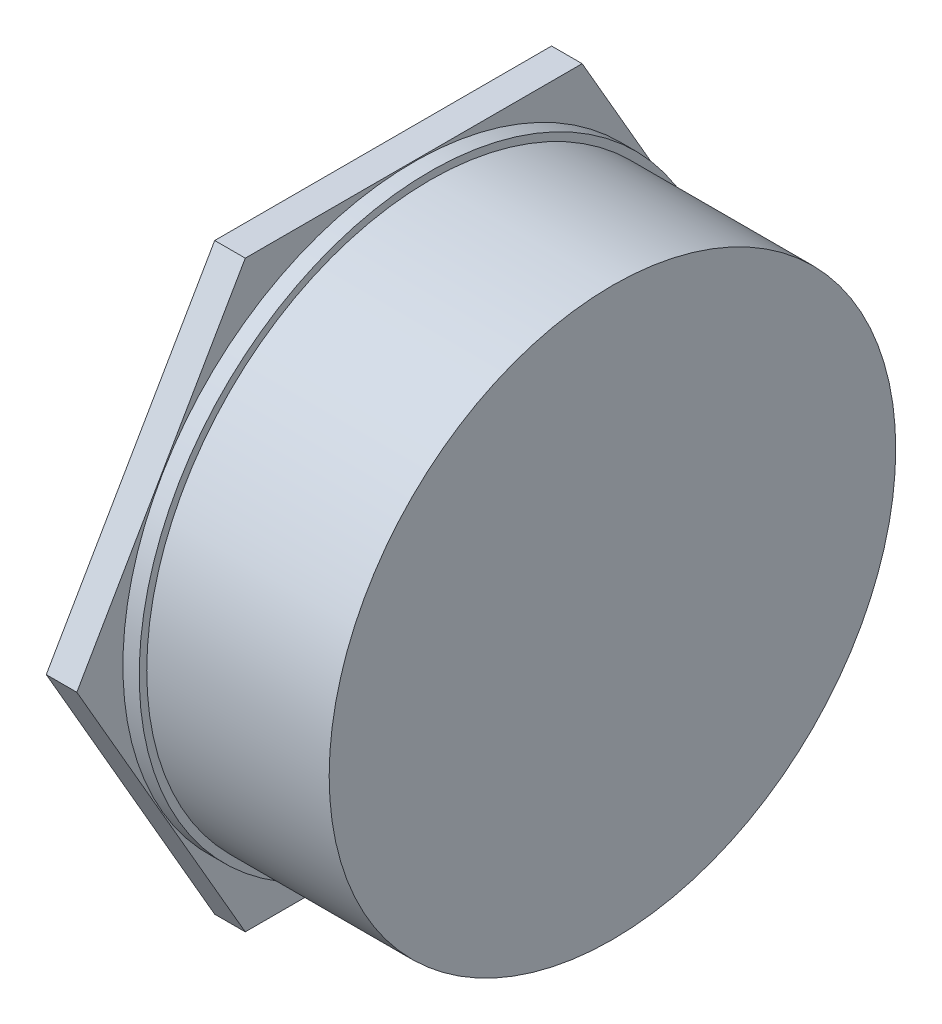
ISO-10303-21;
HEADER;
FILE_DESCRIPTION(('STEP AP214'),'2;1');
FILE_NAME('part.step','',(''),(''),'','','');
FILE_SCHEMA(('AUTOMOTIVE_DESIGN { 1 0 10303 214 1 1 1 1 }'));
ENDSEC;
DATA;
#1=APPLICATION_CONTEXT('core data for automotive mechanical design processes');
#2=APPLICATION_PROTOCOL_DEFINITION('international standard','automotive_design',2000,#1);
#3=PRODUCT_CONTEXT('',#1,'mechanical');
#4=PRODUCT('Part','Part','',(#3));
#5=PRODUCT_RELATED_PRODUCT_CATEGORY('part','',(#4));
#6=PRODUCT_DEFINITION_FORMATION('','',#4);
#7=PRODUCT_DEFINITION_CONTEXT('part definition',#1,'design');
#8=PRODUCT_DEFINITION('design','',#6,#7);
#9=PRODUCT_DEFINITION_SHAPE('','',#8);
#10=(LENGTH_UNIT() NAMED_UNIT(*) SI_UNIT(.MILLI.,.METRE.));
#11=(NAMED_UNIT(*) PLANE_ANGLE_UNIT() SI_UNIT($,.RADIAN.));
#12=(NAMED_UNIT(*) SI_UNIT($,.STERADIAN.) SOLID_ANGLE_UNIT());
#13=UNCERTAINTY_MEASURE_WITH_UNIT(LENGTH_MEASURE(1.E-05),#10,'distance_accuracy_value','');
#14=(GEOMETRIC_REPRESENTATION_CONTEXT(3) GLOBAL_UNCERTAINTY_ASSIGNED_CONTEXT((#13)) GLOBAL_UNIT_ASSIGNED_CONTEXT((#10,
#11,#12)) REPRESENTATION_CONTEXT('',''));
#15=CARTESIAN_POINT('',(0.,0.,0.));
#16=DIRECTION('',(0.,0.,1.));
#17=DIRECTION('',(1.,0.,0.));
#18=AXIS2_PLACEMENT_3D('',#15,#16,#17);
#19=CARTESIAN_POINT('',(45.,0.,0.));
#20=DIRECTION('',(-1.,0.,0.));
#21=DIRECTION('',(0.,0.,1.));
#22=AXIS2_PLACEMENT_3D('',#19,#20,#21);
#23=CYLINDRICAL_SURFACE('',#22,57.07);
#24=CARTESIAN_POINT('',(6.,0.,0.));
#25=DIRECTION('',(1.,0.,0.));
#26=DIRECTION('',(0.,0.,-1.));
#27=AXIS2_PLACEMENT_3D('',#24,#25,#26);
#28=CIRCLE('',#27,57.07);
#29=CARTESIAN_POINT('',(6.,0.,-57.07));
#30=VERTEX_POINT('',#29);
#31=EDGE_CURVE('E121',#30,#30,#28,.T.);
#32=ORIENTED_EDGE('',*,*,#31,.T.);
#33=EDGE_LOOP('',(#32));
#34=FACE_BOUND('',#33,.T.);
#35=CARTESIAN_POINT('',(9.2,0.,0.));
#36=DIRECTION('',(1.,0.,0.));
#37=DIRECTION('',(0.,0.,-1.));
#38=AXIS2_PLACEMENT_3D('',#35,#36,#37);
#39=CIRCLE('',#38,57.07);
#40=CARTESIAN_POINT('',(9.2,0.,-57.07));
#41=VERTEX_POINT('',#40);
#42=EDGE_CURVE('E182',#41,#41,#39,.T.);
#43=ORIENTED_EDGE('',*,*,#42,.F.);
#44=EDGE_LOOP('',(#43));
#45=FACE_BOUND('',#44,.T.);
#46=ADVANCED_FACE('F32',(#34,#45),#23,.T.);
#47=CARTESIAN_POINT('',(6.,0.,-66.1066058222121));
#48=DIRECTION('',(0.,-0.5,0.866025403784439));
#49=DIRECTION('',(0.,-0.866025403784439,-0.5));
#50=AXIS2_PLACEMENT_3D('',#47,#48,#49);
#51=PLANE('',#50);
#52=DIRECTION('',(0.,0.866025403784438,0.5));
#53=VECTOR('',#52,1.);
#54=CARTESIAN_POINT('',(0.,0.,-66.1066058222121));
#55=LINE('',#54,#53);
#56=CARTESIAN_POINT('',(0.,0.,-66.1066058222121));
#57=VERTEX_POINT('',#56);
#58=CARTESIAN_POINT('',(0.,57.25,-33.0533029111061));
#59=VERTEX_POINT('',#58);
#60=EDGE_CURVE('E117',#57,#59,#55,.T.);
#61=ORIENTED_EDGE('',*,*,#60,.T.);
#62=DIRECTION('',(-1.,0.,0.));
#63=VECTOR('',#62,1.);
#64=CARTESIAN_POINT('',(6.,57.25,-33.0533029111061));
#65=LINE('',#64,#63);
#66=CARTESIAN_POINT('',(6.,57.25,-33.0533029111061));
#67=VERTEX_POINT('',#66);
#68=EDGE_CURVE('E11',#67,#59,#65,.T.);
#69=ORIENTED_EDGE('',*,*,#68,.F.);
#70=DIRECTION('',(0.,0.866025403784438,0.5));
#71=VECTOR('',#70,1.);
#72=CARTESIAN_POINT('',(6.,0.,-66.1066058222121));
#73=LINE('',#72,#71);
#74=CARTESIAN_POINT('',(6.,0.,-66.1066058222121));
#75=VERTEX_POINT('',#74);
#76=EDGE_CURVE('E128',#75,#67,#73,.T.);
#77=ORIENTED_EDGE('',*,*,#76,.F.);
#78=DIRECTION('',(-1.,0.,0.));
#79=VECTOR('',#78,1.);
#80=CARTESIAN_POINT('',(6.,0.,-66.1066058222121));
#81=LINE('',#80,#79);
#82=EDGE_CURVE('E113',#75,#57,#81,.T.);
#83=ORIENTED_EDGE('',*,*,#82,.T.);
#84=EDGE_LOOP('',(#61,#69,#77,#83));
#85=FACE_BOUND('',#84,.T.);
#86=ADVANCED_FACE('F34',(#85),#51,.F.);
#87=CARTESIAN_POINT('',(6.,57.25,-33.0533029111061));
#88=DIRECTION('',(0.,-1.,0.));
#89=DIRECTION('',(0.,0.,-1.));
#90=AXIS2_PLACEMENT_3D('',#87,#88,#89);
#91=PLANE('',#90);
#92=DIRECTION('',(0.,0.,1.));
#93=VECTOR('',#92,1.);
#94=CARTESIAN_POINT('',(0.,57.25,-33.0533029111061));
#95=LINE('',#94,#93);
#96=CARTESIAN_POINT('',(0.,57.25,33.0533029111061));
#97=VERTEX_POINT('',#96);
#98=EDGE_CURVE('E120',#59,#97,#95,.T.);
#99=ORIENTED_EDGE('',*,*,#98,.T.);
#100=DIRECTION('',(-1.,0.,0.));
#101=VECTOR('',#100,1.);
#102=CARTESIAN_POINT('',(6.,57.25,33.0533029111061));
#103=LINE('',#102,#101);
#104=CARTESIAN_POINT('',(6.,57.25,33.0533029111061));
#105=VERTEX_POINT('',#104);
#106=EDGE_CURVE('E41',#105,#97,#103,.T.);
#107=ORIENTED_EDGE('',*,*,#106,.F.);
#108=DIRECTION('',(0.,0.,1.));
#109=VECTOR('',#108,1.);
#110=CARTESIAN_POINT('',(6.,57.25,-33.0533029111061));
#111=LINE('',#110,#109);
#112=EDGE_CURVE('E86',#67,#105,#111,.T.);
#113=ORIENTED_EDGE('',*,*,#112,.F.);
#114=ORIENTED_EDGE('',*,*,#68,.T.);
#115=EDGE_LOOP('',(#99,#107,#113,#114));
#116=FACE_BOUND('',#115,.T.);
#117=ADVANCED_FACE('F158',(#116),#91,.F.);
#118=CARTESIAN_POINT('',(6.,57.25,33.0533029111061));
#119=DIRECTION('',(0.,-0.499999999999999,-0.866025403784439));
#120=DIRECTION('',(0.,0.866025403784439,-0.5));
#121=AXIS2_PLACEMENT_3D('',#118,#119,#120);
#122=PLANE('',#121);
#123=DIRECTION('',(0.,-0.866025403784439,0.5));
#124=VECTOR('',#123,1.);
#125=CARTESIAN_POINT('',(0.,57.25,33.0533029111061));
#126=LINE('',#125,#124);
#127=CARTESIAN_POINT('',(0.,0.,66.1066058222122));
#128=VERTEX_POINT('',#127);
#129=EDGE_CURVE('E123',#97,#128,#126,.T.);
#130=ORIENTED_EDGE('',*,*,#129,.T.);
#131=DIRECTION('',(-1.,0.,0.));
#132=VECTOR('',#131,1.);
#133=CARTESIAN_POINT('',(6.,0.,66.1066058222122));
#134=LINE('',#133,#132);
#135=CARTESIAN_POINT('',(6.,0.,66.1066058222122));
#136=VERTEX_POINT('',#135);
#137=EDGE_CURVE('E108',#136,#128,#134,.T.);
#138=ORIENTED_EDGE('',*,*,#137,.F.);
#139=DIRECTION('',(0.,-0.866025403784439,0.5));
#140=VECTOR('',#139,1.);
#141=CARTESIAN_POINT('',(6.,57.25,33.0533029111061));
#142=LINE('',#141,#140);
#143=EDGE_CURVE('E99',#105,#136,#142,.T.);
#144=ORIENTED_EDGE('',*,*,#143,.F.);
#145=ORIENTED_EDGE('',*,*,#106,.T.);
#146=EDGE_LOOP('',(#130,#138,#144,#145));
#147=FACE_BOUND('',#146,.T.);
#148=ADVANCED_FACE('F134',(#147),#122,.F.);
#149=CARTESIAN_POINT('',(6.,0.,66.1066058222122));
#150=DIRECTION('',(0.,0.500000000000001,-0.866025403784438));
#151=DIRECTION('',(0.,0.866025403784438,0.500000000000001));
#152=AXIS2_PLACEMENT_3D('',#149,#150,#151);
#153=PLANE('',#152);
#154=DIRECTION('',(0.,-0.866025403784438,-0.5));
#155=VECTOR('',#154,1.);
#156=CARTESIAN_POINT('',(0.,0.,66.1066058222122));
#157=LINE('',#156,#155);
#158=CARTESIAN_POINT('',(0.,-57.25,33.0533029111061));
#159=VERTEX_POINT('',#158);
#160=EDGE_CURVE('E107',#128,#159,#157,.T.);
#161=ORIENTED_EDGE('',*,*,#160,.T.);
#162=DIRECTION('',(-1.,0.,0.));
#163=VECTOR('',#162,1.);
#164=CARTESIAN_POINT('',(6.,-57.25,33.0533029111061));
#165=LINE('',#164,#163);
#166=CARTESIAN_POINT('',(6.,-57.25,33.0533029111061));
#167=VERTEX_POINT('',#166);
#168=EDGE_CURVE('E104',#167,#159,#165,.T.);
#169=ORIENTED_EDGE('',*,*,#168,.F.);
#170=DIRECTION('',(0.,-0.866025403784438,-0.5));
#171=VECTOR('',#170,1.);
#172=CARTESIAN_POINT('',(6.,0.,66.1066058222122));
#173=LINE('',#172,#171);
#174=EDGE_CURVE('E93',#136,#167,#173,.T.);
#175=ORIENTED_EDGE('',*,*,#174,.F.);
#176=ORIENTED_EDGE('',*,*,#137,.T.);
#177=EDGE_LOOP('',(#161,#169,#175,#176));
#178=FACE_BOUND('',#177,.T.);
#179=ADVANCED_FACE('F105',(#178),#153,.F.);
#180=CARTESIAN_POINT('',(6.,-57.25,33.0533029111061));
#181=DIRECTION('',(0.,1.,0.));
#182=DIRECTION('',(0.,0.,1.));
#183=AXIS2_PLACEMENT_3D('',#180,#181,#182);
#184=PLANE('',#183);
#185=DIRECTION('',(0.,0.,-1.));
#186=VECTOR('',#185,1.);
#187=CARTESIAN_POINT('',(0.,-57.25,33.0533029111061));
#188=LINE('',#187,#186);
#189=CARTESIAN_POINT('',(0.,-57.25,-33.0533029111061));
#190=VERTEX_POINT('',#189);
#191=EDGE_CURVE('E72',#159,#190,#188,.T.);
#192=ORIENTED_EDGE('',*,*,#191,.T.);
#193=DIRECTION('',(-1.,0.,0.));
#194=VECTOR('',#193,1.);
#195=CARTESIAN_POINT('',(6.,-57.25,-33.0533029111061));
#196=LINE('',#195,#194);
#197=CARTESIAN_POINT('',(6.,-57.25,-33.0533029111061));
#198=VERTEX_POINT('',#197);
#199=EDGE_CURVE('E109',#198,#190,#196,.T.);
#200=ORIENTED_EDGE('',*,*,#199,.F.);
#201=DIRECTION('',(0.,0.,-1.));
#202=VECTOR('',#201,1.);
#203=CARTESIAN_POINT('',(6.,-57.25,33.0533029111061));
#204=LINE('',#203,#202);
#205=EDGE_CURVE('E97',#167,#198,#204,.T.);
#206=ORIENTED_EDGE('',*,*,#205,.F.);
#207=ORIENTED_EDGE('',*,*,#168,.T.);
#208=EDGE_LOOP('',(#192,#200,#206,#207));
#209=FACE_BOUND('',#208,.T.);
#210=ADVANCED_FACE('F111',(#209),#184,.F.);
#211=CARTESIAN_POINT('',(6.,-57.25,-33.0533029111061));
#212=DIRECTION('',(0.,0.5,0.866025403784439));
#213=DIRECTION('',(0.,-0.866025403784439,0.5));
#214=AXIS2_PLACEMENT_3D('',#211,#212,#213);
#215=PLANE('',#214);
#216=DIRECTION('',(0.,0.866025403784439,-0.5));
#217=VECTOR('',#216,1.);
#218=CARTESIAN_POINT('',(0.,-57.25,-33.0533029111061));
#219=LINE('',#218,#217);
#220=EDGE_CURVE('E78',#190,#57,#219,.T.);
#221=ORIENTED_EDGE('',*,*,#220,.T.);
#222=ORIENTED_EDGE('',*,*,#82,.F.);
#223=DIRECTION('',(0.,0.866025403784439,-0.5));
#224=VECTOR('',#223,1.);
#225=CARTESIAN_POINT('',(6.,-57.25,-33.0533029111061));
#226=LINE('',#225,#224);
#227=EDGE_CURVE('E49',#198,#75,#226,.T.);
#228=ORIENTED_EDGE('',*,*,#227,.F.);
#229=ORIENTED_EDGE('',*,*,#199,.T.);
#230=EDGE_LOOP('',(#221,#222,#228,#229));
#231=FACE_BOUND('',#230,.T.);
#232=ADVANCED_FACE('F141',(#231),#215,.F.);
#233=CARTESIAN_POINT('',(6.,0.,0.));
#234=DIRECTION('',(1.,0.,0.));
#235=DIRECTION('',(0.,0.,-1.));
#236=AXIS2_PLACEMENT_3D('',#233,#234,#235);
#237=PLANE('',#236);
#238=ORIENTED_EDGE('',*,*,#31,.F.);
#239=EDGE_LOOP('',(#238));
#240=FACE_BOUND('',#239,.T.);
#241=ORIENTED_EDGE('',*,*,#76,.T.);
#242=ORIENTED_EDGE('',*,*,#112,.T.);
#243=ORIENTED_EDGE('',*,*,#143,.T.);
#244=ORIENTED_EDGE('',*,*,#174,.T.);
#245=ORIENTED_EDGE('',*,*,#205,.T.);
#246=ORIENTED_EDGE('',*,*,#227,.T.);
#247=EDGE_LOOP('',(#241,#242,#243,#244,#245,#246));
#248=FACE_BOUND('',#247,.T.);
#249=ADVANCED_FACE('F95',(#240,#248),#237,.T.);
#250=CARTESIAN_POINT('',(0.,0.,0.));
#251=DIRECTION('',(1.,0.,0.));
#252=DIRECTION('',(0.,0.,-1.));
#253=AXIS2_PLACEMENT_3D('',#250,#251,#252);
#254=PLANE('',#253);
#255=ORIENTED_EDGE('',*,*,#60,.F.);
#256=ORIENTED_EDGE('',*,*,#220,.F.);
#257=ORIENTED_EDGE('',*,*,#191,.F.);
#258=ORIENTED_EDGE('',*,*,#160,.F.);
#259=ORIENTED_EDGE('',*,*,#129,.F.);
#260=ORIENTED_EDGE('',*,*,#98,.F.);
#261=EDGE_LOOP('',(#255,#256,#257,#258,#259,#260));
#262=FACE_BOUND('',#261,.T.);
#263=ADVANCED_FACE('F137',(#262),#254,.F.);
#264=CARTESIAN_POINT('',(9.2,0.,0.));
#265=DIRECTION('',(1.,0.,0.));
#266=DIRECTION('',(0.,0.,-1.));
#267=AXIS2_PLACEMENT_3D('',#264,#265,#266);
#268=PLANE('',#267);
#269=CARTESIAN_POINT('',(9.2,0.,0.));
#270=DIRECTION('',(1.,0.,0.));
#271=DIRECTION('',(0.,0.,-1.));
#272=AXIS2_PLACEMENT_3D('',#269,#270,#271);
#273=CIRCLE('',#272,55.591);
#274=CARTESIAN_POINT('',(9.2,0.,-55.591));
#275=VERTEX_POINT('',#274);
#276=EDGE_CURVE('E179',#275,#275,#273,.T.);
#277=ORIENTED_EDGE('',*,*,#276,.F.);
#278=EDGE_LOOP('',(#277));
#279=FACE_BOUND('',#278,.T.);
#280=ORIENTED_EDGE('',*,*,#42,.T.);
#281=EDGE_LOOP('',(#280));
#282=FACE_BOUND('',#281,.T.);
#283=ADVANCED_FACE('F165',(#279,#282),#268,.T.);
#284=CARTESIAN_POINT('',(9.2,0.,0.));
#285=DIRECTION('',(1.,0.,0.));
#286=DIRECTION('',(0.,0.,-1.));
#287=AXIS2_PLACEMENT_3D('',#284,#285,#286);
#288=CYLINDRICAL_SURFACE('',#287,55.591);
#289=CARTESIAN_POINT('',(45.,0.,0.));
#290=DIRECTION('',(1.,0.,0.));
#291=DIRECTION('',(0.,0.,-1.));
#292=AXIS2_PLACEMENT_3D('',#289,#290,#291);
#293=CIRCLE('',#292,55.591);
#294=CARTESIAN_POINT('',(45.,0.,-55.591));
#295=VERTEX_POINT('',#294);
#296=EDGE_CURVE('E185',#295,#295,#293,.T.);
#297=CARTESIAN_POINT('',(9.2,0.,-55.591));
#298=CARTESIAN_POINT('',(9.57291666666667,0.,-55.591));
#299=CARTESIAN_POINT('',(9.94583333333333,0.,-55.591));
#300=CARTESIAN_POINT('',(10.6916666666667,0.,-55.591));
#301=CARTESIAN_POINT('',(11.0645833333333,0.,-55.591));
#302=CARTESIAN_POINT('',(11.8104166666667,0.,-55.591));
#303=CARTESIAN_POINT('',(12.1833333333333,0.,-55.591));
#304=CARTESIAN_POINT('',(12.9291666666667,0.,-55.591));
#305=CARTESIAN_POINT('',(13.3020833333333,0.,-55.591));
#306=CARTESIAN_POINT('',(14.0479166666667,0.,-55.591));
#307=CARTESIAN_POINT('',(14.4208333333333,0.,-55.591));
#308=CARTESIAN_POINT('',(15.1666666666667,0.,-55.591));
#309=CARTESIAN_POINT('',(15.5395833333333,0.,-55.591));
#310=CARTESIAN_POINT('',(16.2854166666667,0.,-55.591));
#311=CARTESIAN_POINT('',(16.6583333333333,0.,-55.591));
#312=CARTESIAN_POINT('',(17.4041666666667,0.,-55.591));
#313=CARTESIAN_POINT('',(17.7770833333333,0.,-55.591));
#314=CARTESIAN_POINT('',(18.5229166666667,0.,-55.591));
#315=CARTESIAN_POINT('',(18.8958333333333,0.,-55.591));
#316=CARTESIAN_POINT('',(19.6416666666667,0.,-55.591));
#317=CARTESIAN_POINT('',(20.0145833333333,0.,-55.591));
#318=CARTESIAN_POINT('',(20.7604166666667,0.,-55.591));
#319=CARTESIAN_POINT('',(21.1333333333333,0.,-55.591));
#320=CARTESIAN_POINT('',(21.8791666666667,0.,-55.591));
#321=CARTESIAN_POINT('',(22.2520833333333,0.,-55.591));
#322=CARTESIAN_POINT('',(22.9979166666667,0.,-55.591));
#323=CARTESIAN_POINT('',(23.3708333333333,0.,-55.591));
#324=CARTESIAN_POINT('',(24.1166666666667,0.,-55.591));
#325=CARTESIAN_POINT('',(24.4895833333333,0.,-55.591));
#326=CARTESIAN_POINT('',(25.2354166666667,0.,-55.591));
#327=CARTESIAN_POINT('',(25.6083333333333,0.,-55.591));
#328=CARTESIAN_POINT('',(26.3541666666667,0.,-55.591));
#329=CARTESIAN_POINT('',(26.7270833333333,0.,-55.591));
#330=CARTESIAN_POINT('',(27.4729166666667,0.,-55.591));
#331=CARTESIAN_POINT('',(27.8458333333333,0.,-55.591));
#332=CARTESIAN_POINT('',(28.5916666666667,0.,-55.591));
#333=CARTESIAN_POINT('',(28.9645833333333,0.,-55.591));
#334=CARTESIAN_POINT('',(29.7104166666667,0.,-55.591));
#335=CARTESIAN_POINT('',(30.0833333333333,0.,-55.591));
#336=CARTESIAN_POINT('',(30.8291666666667,0.,-55.591));
#337=CARTESIAN_POINT('',(31.2020833333333,0.,-55.591));
#338=CARTESIAN_POINT('',(31.9479166666667,0.,-55.591));
#339=CARTESIAN_POINT('',(32.3208333333333,0.,-55.591));
#340=CARTESIAN_POINT('',(33.0666666666667,0.,-55.591));
#341=CARTESIAN_POINT('',(33.4395833333333,0.,-55.591));
#342=CARTESIAN_POINT('',(34.1854166666667,0.,-55.591));
#343=CARTESIAN_POINT('',(34.5583333333333,0.,-55.591));
#344=CARTESIAN_POINT('',(35.3041666666667,0.,-55.591));
#345=CARTESIAN_POINT('',(35.6770833333333,0.,-55.591));
#346=CARTESIAN_POINT('',(36.4229166666667,0.,-55.591));
#347=CARTESIAN_POINT('',(36.7958333333333,0.,-55.591));
#348=CARTESIAN_POINT('',(37.5416666666667,0.,-55.591));
#349=CARTESIAN_POINT('',(37.9145833333333,0.,-55.591));
#350=CARTESIAN_POINT('',(38.6604166666667,0.,-55.591));
#351=CARTESIAN_POINT('',(39.0333333333333,0.,-55.591));
#352=CARTESIAN_POINT('',(39.7791666666667,0.,-55.591));
#353=CARTESIAN_POINT('',(40.1520833333333,0.,-55.591));
#354=CARTESIAN_POINT('',(40.8979166666667,0.,-55.591));
#355=CARTESIAN_POINT('',(41.2708333333333,0.,-55.591));
#356=CARTESIAN_POINT('',(42.0166666666667,0.,-55.591));
#357=CARTESIAN_POINT('',(42.3895833333333,0.,-55.591));
#358=CARTESIAN_POINT('',(43.1354166666667,0.,-55.591));
#359=CARTESIAN_POINT('',(43.5083333333333,0.,-55.591));
#360=CARTESIAN_POINT('',(44.2541666666667,0.,-55.591));
#361=CARTESIAN_POINT('',(44.6270833333333,0.,-55.591));
#362=CARTESIAN_POINT('',(45.,0.,-55.591));
#363=B_SPLINE_CURVE_WITH_KNOTS('',3,(#297,#298,#299,#300,#301,#302,#303,#304,#305,#306,#307,
#308,#309,#310,#311,#312,#313,#314,#315,#316,#317,#318,#319,#320,#321,#322,#323,#324,#325,#326,
#327,#328,#329,#330,#331,#332,#333,#334,#335,#336,#337,#338,#339,#340,#341,#342,#343,#344,#345,
#346,#347,#348,#349,#350,#351,#352,#353,#354,#355,#356,#357,#358,#359,#360,#361,#362),
.UNSPECIFIED.,.F.,.F.,(4,2,2,2,2,2,2,2,2,2,2,2,2,2,2,2,2,2,2,2,2,2,2,2,2,2,2,2,2,2,2,2,4),(0.,
1.11875,2.2375,3.35625,4.475,5.59375,6.7125,7.83125,8.95,10.06875,11.1875,12.30625,13.425,
14.54375,15.6625,16.78125,17.9,19.01875,20.1375,21.25625,22.375,23.49375,24.6125,25.73125,26.85,
27.96875,29.0875,30.20625,31.325,32.44375,33.5625,34.68125,35.8),.UNSPECIFIED.);
#364=EDGE_CURVE('BSEAM169',#275,#295,#363,.T.);
#365=ORIENTED_EDGE('',*,*,#276,.T.);
#366=ORIENTED_EDGE('',*,*,#296,.F.);
#367=ORIENTED_EDGE('',*,*,#364,.T.);
#368=ORIENTED_EDGE('',*,*,#364,.F.);
#369=EDGE_LOOP('',(#365,#367,#366,#368));
#370=FACE_BOUND('',#369,.T.);
#371=ADVANCED_FACE('F169',(#370),#288,.T.);
#372=CARTESIAN_POINT('',(45.,0.,0.));
#373=DIRECTION('',(1.,0.,0.));
#374=DIRECTION('',(0.,0.,-1.));
#375=AXIS2_PLACEMENT_3D('',#372,#373,#374);
#376=PLANE('',#375);
#377=ORIENTED_EDGE('',*,*,#296,.T.);
#378=EDGE_LOOP('',(#377));
#379=FACE_BOUND('',#378,.T.);
#380=ADVANCED_FACE('F162',(#379),#376,.T.);
#381=CLOSED_SHELL('',(#46,#86,#117,#148,#179,#210,#232,#249,#263,#283,#371,#380));
#382=MANIFOLD_SOLID_BREP('B2',#381);
#383=ADVANCED_BREP_SHAPE_REPRESENTATION('',(#18,#382),#14);
#384=SHAPE_DEFINITION_REPRESENTATION(#9,#383);
ENDSEC;
END-ISO-10303-21;
